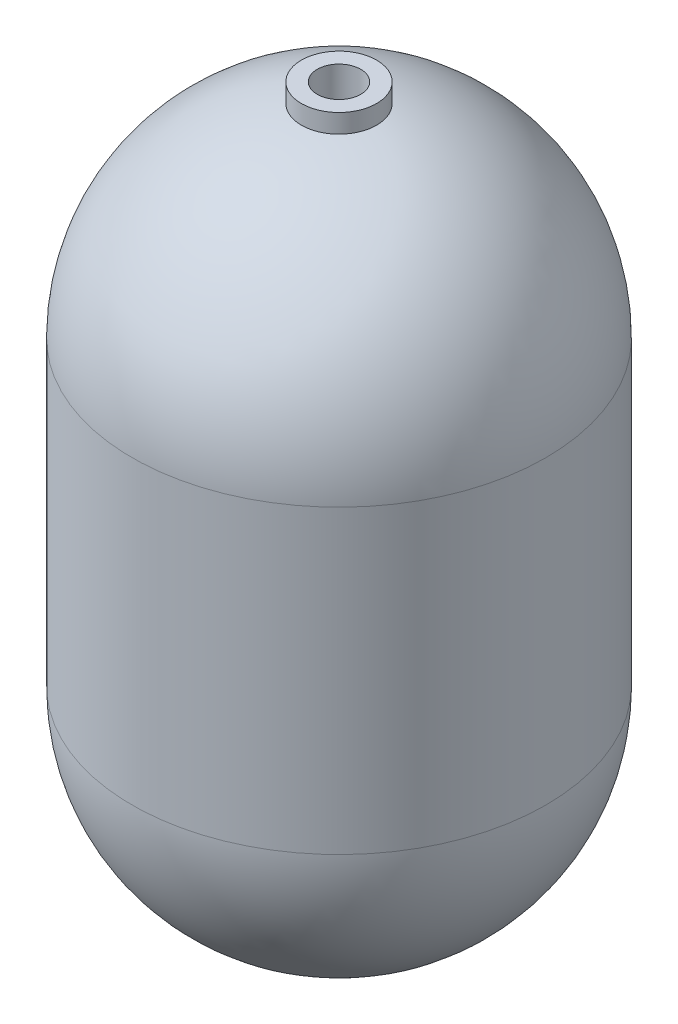
ISO-10303-21;
HEADER;
FILE_DESCRIPTION(('STEP AP214'),'2;1');
FILE_NAME('part.step','',(''),(''),'','','');
FILE_SCHEMA(('AUTOMOTIVE_DESIGN { 1 0 10303 214 1 1 1 1 }'));
ENDSEC;
DATA;
#1=APPLICATION_CONTEXT('core data for automotive mechanical design processes');
#2=APPLICATION_PROTOCOL_DEFINITION('international standard','automotive_design',2000,#1);
#3=PRODUCT_CONTEXT('',#1,'mechanical');
#4=PRODUCT('Part','Part','',(#3));
#5=PRODUCT_RELATED_PRODUCT_CATEGORY('part','',(#4));
#6=PRODUCT_DEFINITION_FORMATION('','',#4);
#7=PRODUCT_DEFINITION_CONTEXT('part definition',#1,'design');
#8=PRODUCT_DEFINITION('design','',#6,#7);
#9=PRODUCT_DEFINITION_SHAPE('','',#8);
#10=(LENGTH_UNIT() NAMED_UNIT(*) SI_UNIT(.MILLI.,.METRE.));
#11=(NAMED_UNIT(*) PLANE_ANGLE_UNIT() SI_UNIT($,.RADIAN.));
#12=(NAMED_UNIT(*) SI_UNIT($,.STERADIAN.) SOLID_ANGLE_UNIT());
#13=UNCERTAINTY_MEASURE_WITH_UNIT(LENGTH_MEASURE(1.E-05),#10,'distance_accuracy_value','');
#14=(GEOMETRIC_REPRESENTATION_CONTEXT(3) GLOBAL_UNCERTAINTY_ASSIGNED_CONTEXT((#13)) GLOBAL_UNIT_ASSIGNED_CONTEXT((#10,
#11,#12)) REPRESENTATION_CONTEXT('',''));
#15=CARTESIAN_POINT('',(0.,0.,0.));
#16=DIRECTION('',(0.,0.,1.));
#17=DIRECTION('',(1.,0.,0.));
#18=AXIS2_PLACEMENT_3D('',#15,#16,#17);
#19=CARTESIAN_POINT('',(6.35,75.035751797589,0.));
#20=DIRECTION('',(0.,-1.,0.));
#21=DIRECTION('',(1.,0.,0.));
#22=AXIS2_PLACEMENT_3D('',#19,#20,#21);
#23=PLANE('',#22);
#24=CARTESIAN_POINT('',(0.,75.035751797589,0.));
#25=DIRECTION('',(0.,1.,0.));
#26=DIRECTION('',(0.,0.,1.));
#27=AXIS2_PLACEMENT_3D('',#24,#25,#26);
#28=CIRCLE('',#27,7.34186999999999);
#29=CARTESIAN_POINT('',(0.,75.035751797589,7.34186999999999));
#30=VERTEX_POINT('',#29);
#31=EDGE_CURVE('E63',#30,#30,#28,.T.);
#32=ORIENTED_EDGE('',*,*,#31,.F.);
#33=EDGE_LOOP('',(#32));
#34=FACE_BOUND('',#33,.T.);
#35=CARTESIAN_POINT('',(0.,75.035751797589,0.));
#36=DIRECTION('',(0.,1.,0.));
#37=DIRECTION('',(-1.,0.,0.));
#38=AXIS2_PLACEMENT_3D('',#35,#36,#37);
#39=CIRCLE('',#38,12.7);
#40=CARTESIAN_POINT('',(-12.7,75.035751797589,0.));
#41=VERTEX_POINT('',#40);
#42=EDGE_CURVE('E57',#41,#41,#39,.T.);
#43=ORIENTED_EDGE('',*,*,#42,.T.);
#44=EDGE_LOOP('',(#43));
#45=FACE_BOUND('',#44,.T.);
#46=ADVANCED_FACE('F35',(#34,#45),#23,.F.);
#47=CARTESIAN_POINT('',(0.,-101.6,0.));
#48=DIRECTION('',(0.,1.,0.));
#49=DIRECTION('',(1.,0.,0.));
#50=AXIS2_PLACEMENT_3D('',#47,#48,#49);
#51=SPHERICAL_SURFACE('',#50,69.85);
#52=CARTESIAN_POINT('',(0.,-101.6,0.));
#53=DIRECTION('',(0.,1.,0.));
#54=DIRECTION('',(-1.,0.,0.));
#55=AXIS2_PLACEMENT_3D('',#52,#53,#54);
#56=CIRCLE('',#55,69.85);
#57=CARTESIAN_POINT('',(-69.85,-101.6,0.));
#58=VERTEX_POINT('',#57);
#59=EDGE_CURVE('E45',#58,#58,#56,.T.);
#60=ORIENTED_EDGE('',*,*,#59,.F.);
#61=EDGE_LOOP('',(#60));
#62=FACE_BOUND('',#61,.T.);
#63=ADVANCED_FACE('F72',(#62),#51,.T.);
#64=CARTESIAN_POINT('',(0.,80.4478853232941,0.));
#65=DIRECTION('',(0.,1.,0.));
#66=DIRECTION('',(-1.,0.,0.));
#67=AXIS2_PLACEMENT_3D('',#64,#65,#66);
#68=CYLINDRICAL_SURFACE('',#67,69.85);
#69=CARTESIAN_POINT('',(0.,0.,0.));
#70=DIRECTION('',(0.,1.,0.));
#71=DIRECTION('',(-1.,0.,0.));
#72=AXIS2_PLACEMENT_3D('',#69,#70,#71);
#73=CIRCLE('',#72,69.85);
#74=CARTESIAN_POINT('',(-69.85,0.,0.));
#75=VERTEX_POINT('',#74);
#76=EDGE_CURVE('E49',#75,#75,#73,.T.);
#77=ORIENTED_EDGE('',*,*,#76,.F.);
#78=EDGE_LOOP('',(#77));
#79=FACE_BOUND('',#78,.T.);
#80=ORIENTED_EDGE('',*,*,#59,.T.);
#81=EDGE_LOOP('',(#80));
#82=FACE_BOUND('',#81,.T.);
#83=ADVANCED_FACE('F84',(#79,#82),#68,.T.);
#84=CARTESIAN_POINT('',(0.,0.,0.));
#85=DIRECTION('',(0.,1.,0.));
#86=DIRECTION('',(1.,0.,0.));
#87=AXIS2_PLACEMENT_3D('',#84,#85,#86);
#88=SPHERICAL_SURFACE('',#87,69.85);
#89=CARTESIAN_POINT('',(0.,68.685751797589,0.));
#90=DIRECTION('',(0.,1.,0.));
#91=DIRECTION('',(-1.,0.,0.));
#92=AXIS2_PLACEMENT_3D('',#89,#90,#91);
#93=CIRCLE('',#92,12.7);
#94=CARTESIAN_POINT('',(-12.7,68.685751797589,0.));
#95=VERTEX_POINT('',#94);
#96=EDGE_CURVE('E54',#95,#95,#93,.T.);
#97=ORIENTED_EDGE('',*,*,#96,.F.);
#98=EDGE_LOOP('',(#97));
#99=FACE_BOUND('',#98,.T.);
#100=ORIENTED_EDGE('',*,*,#76,.T.);
#101=EDGE_LOOP('',(#100));
#102=FACE_BOUND('',#101,.T.);
#103=ADVANCED_FACE('F78',(#99,#102),#88,.T.);
#104=CARTESIAN_POINT('',(0.,80.4478853232941,0.));
#105=DIRECTION('',(0.,1.,0.));
#106=DIRECTION('',(-1.,0.,0.));
#107=AXIS2_PLACEMENT_3D('',#104,#105,#106);
#108=CYLINDRICAL_SURFACE('',#107,12.7);
#109=ORIENTED_EDGE('',*,*,#42,.F.);
#110=EDGE_LOOP('',(#109));
#111=FACE_BOUND('',#110,.T.);
#112=ORIENTED_EDGE('',*,*,#96,.T.);
#113=EDGE_LOOP('',(#112));
#114=FACE_BOUND('',#113,.T.);
#115=ADVANCED_FACE('F75',(#111,#114),#108,.T.);
#116=CARTESIAN_POINT('',(0.,75.035751797589,0.));
#117=DIRECTION('',(0.,1.,0.));
#118=DIRECTION('',(0.,0.,1.));
#119=AXIS2_PLACEMENT_3D('',#116,#117,#118);
#120=CYLINDRICAL_SURFACE('',#119,7.34186999999999);
#121=ORIENTED_EDGE('',*,*,#31,.T.);
#122=EDGE_LOOP('',(#121));
#123=FACE_BOUND('',#122,.T.);
#124=CARTESIAN_POINT('',(0.,63.0741384792777,0.));
#125=DIRECTION('',(0.,-1.,0.));
#126=DIRECTION('',(0.,0.,-1.));
#127=AXIS2_PLACEMENT_3D('',#124,#125,#126);
#128=CIRCLE('',#127,7.34186999999999);
#129=CARTESIAN_POINT('',(0.,63.0741384792777,-7.34186999999999));
#130=VERTEX_POINT('',#129);
#131=EDGE_CURVE('E60',#130,#130,#128,.F.);
#132=ORIENTED_EDGE('',*,*,#131,.F.);
#133=EDGE_LOOP('',(#132));
#134=FACE_BOUND('',#133,.T.);
#135=ADVANCED_FACE('F67',(#123,#134),#120,.F.);
#136=CARTESIAN_POINT('',(0.,-101.6,0.));
#137=DIRECTION('',(0.,1.,0.));
#138=DIRECTION('',(1.,0.,0.));
#139=AXIS2_PLACEMENT_3D('',#136,#137,#138);
#140=SPHERICAL_SURFACE('',#139,63.5);
#141=CARTESIAN_POINT('',(0.,-101.6,0.));
#142=DIRECTION('',(0.,1.,0.));
#143=DIRECTION('',(-1.,0.,0.));
#144=AXIS2_PLACEMENT_3D('',#141,#142,#143);
#145=CIRCLE('',#144,63.5);
#146=CARTESIAN_POINT('',(-63.5,-101.6,0.));
#147=VERTEX_POINT('',#146);
#148=EDGE_CURVE('E41',#147,#147,#145,.T.);
#149=ORIENTED_EDGE('',*,*,#148,.T.);
#150=EDGE_LOOP('',(#149));
#151=FACE_BOUND('',#150,.T.);
#152=ADVANCED_FACE('F98',(#151),#140,.F.);
#153=CARTESIAN_POINT('',(0.,80.4478853232941,0.));
#154=DIRECTION('',(0.,1.,0.));
#155=DIRECTION('',(-1.,0.,0.));
#156=AXIS2_PLACEMENT_3D('',#153,#154,#155);
#157=CYLINDRICAL_SURFACE('',#156,63.5);
#158=ORIENTED_EDGE('',*,*,#148,.F.);
#159=EDGE_LOOP('',(#158));
#160=FACE_BOUND('',#159,.T.);
#161=CARTESIAN_POINT('',(0.,0.,0.));
#162=DIRECTION('',(0.,1.,0.));
#163=DIRECTION('',(-1.,0.,0.));
#164=AXIS2_PLACEMENT_3D('',#161,#162,#163);
#165=CIRCLE('',#164,63.5);
#166=CARTESIAN_POINT('',(-63.5,0.,0.));
#167=VERTEX_POINT('',#166);
#168=EDGE_CURVE('E10',#167,#167,#165,.T.);
#169=ORIENTED_EDGE('',*,*,#168,.T.);
#170=EDGE_LOOP('',(#169));
#171=FACE_BOUND('',#170,.T.);
#172=ADVANCED_FACE('F101',(#160,#171),#157,.F.);
#173=CARTESIAN_POINT('',(0.,0.,0.));
#174=DIRECTION('',(0.,1.,0.));
#175=DIRECTION('',(1.,0.,0.));
#176=AXIS2_PLACEMENT_3D('',#173,#174,#175);
#177=SPHERICAL_SURFACE('',#176,63.5);
#178=ORIENTED_EDGE('',*,*,#131,.T.);
#179=EDGE_LOOP('',(#178));
#180=FACE_BOUND('',#179,.T.);
#181=ORIENTED_EDGE('',*,*,#168,.F.);
#182=EDGE_LOOP('',(#181));
#183=FACE_BOUND('',#182,.T.);
#184=ADVANCED_FACE('F103',(#180,#183),#177,.F.);
#185=CLOSED_SHELL('',(#46,#63,#83,#103,#115,#135,#152,#172,#184));
#186=MANIFOLD_SOLID_BREP('B2',#185);
#187=ADVANCED_BREP_SHAPE_REPRESENTATION('',(#18,#186),#14);
#188=SHAPE_DEFINITION_REPRESENTATION(#9,#187);
ENDSEC;
END-ISO-10303-21;
